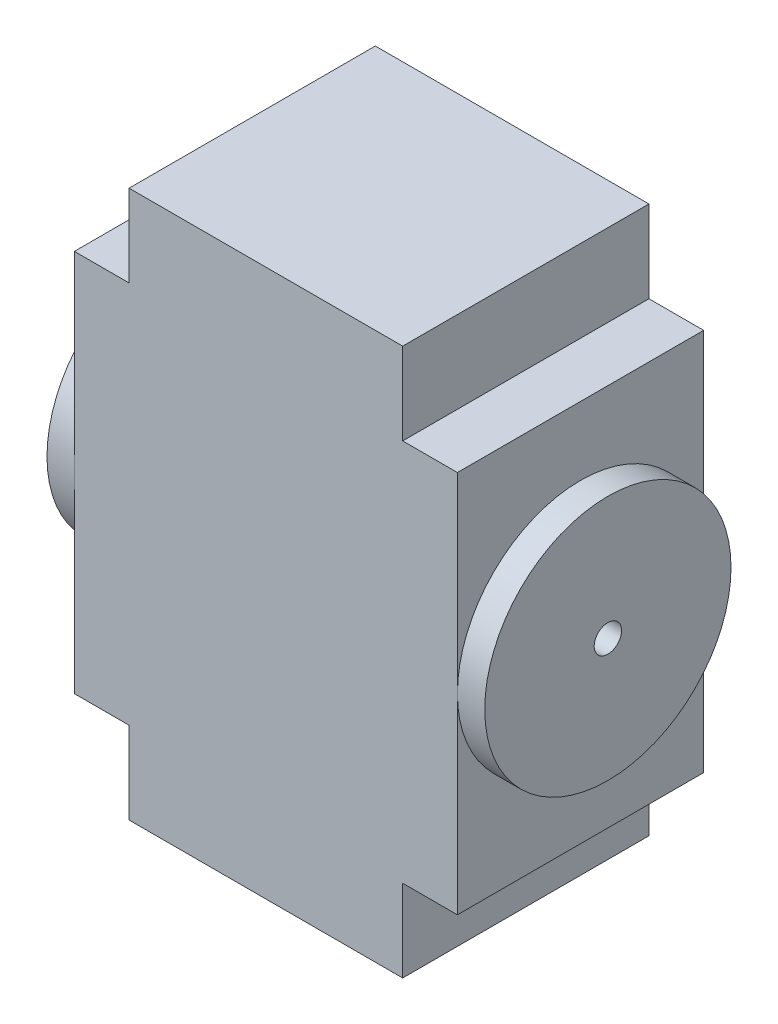
ISO-10303-21;
HEADER;
FILE_DESCRIPTION(('STEP AP214'),'2;1');
FILE_NAME('part.step','',(''),(''),'','','');
FILE_SCHEMA(('AUTOMOTIVE_DESIGN { 1 0 10303 214 1 1 1 1 }'));
ENDSEC;
DATA;
#1=APPLICATION_CONTEXT('core data for automotive mechanical design processes');
#2=APPLICATION_PROTOCOL_DEFINITION('international standard','automotive_design',2000,#1);
#3=PRODUCT_CONTEXT('',#1,'mechanical');
#4=PRODUCT('Part','Part','',(#3));
#5=PRODUCT_RELATED_PRODUCT_CATEGORY('part','',(#4));
#6=PRODUCT_DEFINITION_FORMATION('','',#4);
#7=PRODUCT_DEFINITION_CONTEXT('part definition',#1,'design');
#8=PRODUCT_DEFINITION('design','',#6,#7);
#9=PRODUCT_DEFINITION_SHAPE('','',#8);
#10=(LENGTH_UNIT() NAMED_UNIT(*) SI_UNIT(.MILLI.,.METRE.));
#11=(NAMED_UNIT(*) PLANE_ANGLE_UNIT() SI_UNIT($,.RADIAN.));
#12=(NAMED_UNIT(*) SI_UNIT($,.STERADIAN.) SOLID_ANGLE_UNIT());
#13=UNCERTAINTY_MEASURE_WITH_UNIT(LENGTH_MEASURE(1.E-05),#10,'distance_accuracy_value','');
#14=(GEOMETRIC_REPRESENTATION_CONTEXT(3) GLOBAL_UNCERTAINTY_ASSIGNED_CONTEXT((#13)) GLOBAL_UNIT_ASSIGNED_CONTEXT((#10,
#11,#12)) REPRESENTATION_CONTEXT('',''));
#15=CARTESIAN_POINT('',(0.,0.,0.));
#16=DIRECTION('',(0.,0.,1.));
#17=DIRECTION('',(1.,0.,0.));
#18=AXIS2_PLACEMENT_3D('',#15,#16,#17);
#19=CARTESIAN_POINT('',(-3.5,0.,0.));
#20=DIRECTION('',(-1.,0.,0.));
#21=DIRECTION('',(0.,0.,1.));
#22=AXIS2_PLACEMENT_3D('',#19,#20,#21);
#23=PLANE('',#22);
#24=DIRECTION('',(0.,-1.,0.));
#25=VECTOR('',#24,1.);
#26=CARTESIAN_POINT('',(-3.5,-3.5,0.));
#27=LINE('',#26,#25);
#28=CARTESIAN_POINT('',(-3.5,3.5,0.));
#29=VERTEX_POINT('',#28);
#30=CARTESIAN_POINT('',(-3.5,0.,0.));
#31=VERTEX_POINT('',#30);
#32=EDGE_CURVE('E152',#29,#31,#27,.T.);
#33=ORIENTED_EDGE('',*,*,#32,.T.);
#34=CARTESIAN_POINT('',(-3.5,0.,2.25));
#35=DIRECTION('',(1.,0.,0.));
#36=DIRECTION('',(0.,0.,-1.));
#37=AXIS2_PLACEMENT_3D('',#34,#35,#36);
#38=CIRCLE('',#37,2.25);
#39=CARTESIAN_POINT('',(-3.5,0.,4.5));
#40=VERTEX_POINT('',#39);
#41=EDGE_CURVE('E55',#31,#40,#38,.T.);
#42=ORIENTED_EDGE('',*,*,#41,.T.);
#43=DIRECTION('',(0.,1.,0.));
#44=VECTOR('',#43,1.);
#45=CARTESIAN_POINT('',(-3.5,-3.5,4.5));
#46=LINE('',#45,#44);
#47=CARTESIAN_POINT('',(-3.5,3.5,4.5));
#48=VERTEX_POINT('',#47);
#49=EDGE_CURVE('E149',#40,#48,#46,.T.);
#50=ORIENTED_EDGE('',*,*,#49,.T.);
#51=DIRECTION('',(0.,0.,-1.));
#52=VECTOR('',#51,1.);
#53=CARTESIAN_POINT('',(-3.5,3.5,4.5));
#54=LINE('',#53,#52);
#55=EDGE_CURVE('E173',#48,#29,#54,.T.);
#56=ORIENTED_EDGE('',*,*,#55,.T.);
#57=EDGE_LOOP('',(#33,#42,#50,#56));
#58=FACE_BOUND('',#57,.T.);
#59=ADVANCED_FACE('F43',(#58),#23,.T.);
#60=CARTESIAN_POINT('',(3.5,0.,0.));
#61=DIRECTION('',(-1.,0.,0.));
#62=DIRECTION('',(0.,0.,1.));
#63=AXIS2_PLACEMENT_3D('',#60,#61,#62);
#64=PLANE('',#63);
#65=CARTESIAN_POINT('',(3.5,0.,2.25));
#66=DIRECTION('',(1.,0.,0.));
#67=DIRECTION('',(0.,0.,-1.));
#68=AXIS2_PLACEMENT_3D('',#65,#66,#67);
#69=CIRCLE('',#68,2.25);
#70=CARTESIAN_POINT('',(3.5,0.,0.));
#71=VERTEX_POINT('',#70);
#72=CARTESIAN_POINT('',(3.5,0.,4.5));
#73=VERTEX_POINT('',#72);
#74=EDGE_CURVE('E290',#71,#73,#69,.T.);
#75=ORIENTED_EDGE('',*,*,#74,.F.);
#76=DIRECTION('',(0.,1.,0.));
#77=VECTOR('',#76,1.);
#78=CARTESIAN_POINT('',(3.5,-3.5,0.));
#79=LINE('',#78,#77);
#80=CARTESIAN_POINT('',(3.5,3.5,0.));
#81=VERTEX_POINT('',#80);
#82=EDGE_CURVE('E207',#71,#81,#79,.T.);
#83=ORIENTED_EDGE('',*,*,#82,.T.);
#84=DIRECTION('',(0.,0.,1.));
#85=VECTOR('',#84,1.);
#86=CARTESIAN_POINT('',(3.5,3.5,4.5));
#87=LINE('',#86,#85);
#88=CARTESIAN_POINT('',(3.5,3.5,4.5));
#89=VERTEX_POINT('',#88);
#90=EDGE_CURVE('E206',#81,#89,#87,.T.);
#91=ORIENTED_EDGE('',*,*,#90,.T.);
#92=DIRECTION('',(0.,-1.,0.));
#93=VECTOR('',#92,1.);
#94=CARTESIAN_POINT('',(3.5,-3.5,4.5));
#95=LINE('',#94,#93);
#96=EDGE_CURVE('E211',#89,#73,#95,.T.);
#97=ORIENTED_EDGE('',*,*,#96,.T.);
#98=EDGE_LOOP('',(#75,#83,#91,#97));
#99=FACE_BOUND('',#98,.T.);
#100=ADVANCED_FACE('F345',(#99),#64,.F.);
#101=CARTESIAN_POINT('',(-2.5,-5.,4.5));
#102=DIRECTION('',(1.,0.,0.));
#103=DIRECTION('',(0.,0.,-1.));
#104=AXIS2_PLACEMENT_3D('',#101,#102,#103);
#105=PLANE('',#104);
#106=DIRECTION('',(0.,0.,-1.));
#107=VECTOR('',#106,1.);
#108=CARTESIAN_POINT('',(-2.5,3.5,4.5));
#109=LINE('',#108,#107);
#110=CARTESIAN_POINT('',(-2.5,3.5,4.5));
#111=VERTEX_POINT('',#110);
#112=CARTESIAN_POINT('',(-2.5,3.5,0.));
#113=VERTEX_POINT('',#112);
#114=EDGE_CURVE('E184',#111,#113,#109,.T.);
#115=ORIENTED_EDGE('',*,*,#114,.F.);
#116=DIRECTION('',(0.,-1.,0.));
#117=VECTOR('',#116,1.);
#118=CARTESIAN_POINT('',(-2.5,-5.,4.5));
#119=LINE('',#118,#117);
#120=CARTESIAN_POINT('',(-2.5,5.,4.5));
#121=VERTEX_POINT('',#120);
#122=EDGE_CURVE('E250',#121,#111,#119,.T.);
#123=ORIENTED_EDGE('',*,*,#122,.F.);
#124=DIRECTION('',(0.,0.,-1.));
#125=VECTOR('',#124,1.);
#126=CARTESIAN_POINT('',(-2.5,5.,4.5));
#127=LINE('',#126,#125);
#128=CARTESIAN_POINT('',(-2.5,5.,0.));
#129=VERTEX_POINT('',#128);
#130=EDGE_CURVE('E276',#121,#129,#127,.T.);
#131=ORIENTED_EDGE('',*,*,#130,.T.);
#132=DIRECTION('',(0.,-1.,0.));
#133=VECTOR('',#132,1.);
#134=CARTESIAN_POINT('',(-2.5,-5.,0.));
#135=LINE('',#134,#133);
#136=EDGE_CURVE('E264',#129,#113,#135,.T.);
#137=ORIENTED_EDGE('',*,*,#136,.T.);
#138=EDGE_LOOP('',(#115,#123,#131,#137));
#139=FACE_BOUND('',#138,.T.);
#140=ADVANCED_FACE('F350',(#139),#105,.F.);
#141=DIRECTION('',(0.,0.,1.));
#142=VECTOR('',#141,1.);
#143=CARTESIAN_POINT('',(-2.5,-3.5,4.5));
#144=LINE('',#143,#142);
#145=CARTESIAN_POINT('',(-2.5,-3.5,0.));
#146=VERTEX_POINT('',#145);
#147=CARTESIAN_POINT('',(-2.5,-3.5,4.5));
#148=VERTEX_POINT('',#147);
#149=EDGE_CURVE('E180',#146,#148,#144,.T.);
#150=ORIENTED_EDGE('',*,*,#149,.F.);
#151=CARTESIAN_POINT('',(-2.5,-5.,0.));
#152=VERTEX_POINT('',#151);
#153=EDGE_CURVE('E263',#146,#152,#135,.T.);
#154=ORIENTED_EDGE('',*,*,#153,.T.);
#155=DIRECTION('',(0.,0.,-1.));
#156=VECTOR('',#155,1.);
#157=CARTESIAN_POINT('',(-2.5,-5.,4.5));
#158=LINE('',#157,#156);
#159=CARTESIAN_POINT('',(-2.5,-5.,4.5));
#160=VERTEX_POINT('',#159);
#161=EDGE_CURVE('E273',#160,#152,#158,.T.);
#162=ORIENTED_EDGE('',*,*,#161,.F.);
#163=EDGE_CURVE('E249',#148,#160,#119,.T.);
#164=ORIENTED_EDGE('',*,*,#163,.F.);
#165=EDGE_LOOP('',(#150,#154,#162,#164));
#166=FACE_BOUND('',#165,.T.);
#167=ADVANCED_FACE('F393',(#166),#105,.F.);
#168=CARTESIAN_POINT('',(2.5,-5.,4.5));
#169=DIRECTION('',(-1.,0.,0.));
#170=DIRECTION('',(0.,0.,1.));
#171=AXIS2_PLACEMENT_3D('',#168,#169,#170);
#172=PLANE('',#171);
#173=DIRECTION('',(0.,0.,-1.));
#174=VECTOR('',#173,1.);
#175=CARTESIAN_POINT('',(2.5,-3.5,4.5));
#176=LINE('',#175,#174);
#177=CARTESIAN_POINT('',(2.5,-3.5,4.5));
#178=VERTEX_POINT('',#177);
#179=CARTESIAN_POINT('',(2.5,-3.5,0.));
#180=VERTEX_POINT('',#179);
#181=EDGE_CURVE('E222',#178,#180,#176,.T.);
#182=ORIENTED_EDGE('',*,*,#181,.F.);
#183=DIRECTION('',(0.,1.,0.));
#184=VECTOR('',#183,1.);
#185=CARTESIAN_POINT('',(2.5,-5.,4.5));
#186=LINE('',#185,#184);
#187=CARTESIAN_POINT('',(2.5,-5.,4.5));
#188=VERTEX_POINT('',#187);
#189=EDGE_CURVE('E242',#188,#178,#186,.T.);
#190=ORIENTED_EDGE('',*,*,#189,.F.);
#191=DIRECTION('',(0.,0.,-1.));
#192=VECTOR('',#191,1.);
#193=CARTESIAN_POINT('',(2.5,-5.,4.5));
#194=LINE('',#193,#192);
#195=CARTESIAN_POINT('',(2.5,-5.,0.));
#196=VERTEX_POINT('',#195);
#197=EDGE_CURVE('E256',#188,#196,#194,.T.);
#198=ORIENTED_EDGE('',*,*,#197,.T.);
#199=DIRECTION('',(0.,1.,0.));
#200=VECTOR('',#199,1.);
#201=CARTESIAN_POINT('',(2.5,-5.,0.));
#202=LINE('',#201,#200);
#203=EDGE_CURVE('E257',#196,#180,#202,.T.);
#204=ORIENTED_EDGE('',*,*,#203,.T.);
#205=EDGE_LOOP('',(#182,#190,#198,#204));
#206=FACE_BOUND('',#205,.T.);
#207=ADVANCED_FACE('F45',(#206),#172,.F.);
#208=DIRECTION('',(0.,0.,1.));
#209=VECTOR('',#208,1.);
#210=CARTESIAN_POINT('',(2.5,3.5,4.5));
#211=LINE('',#210,#209);
#212=CARTESIAN_POINT('',(2.5,3.5,0.));
#213=VERTEX_POINT('',#212);
#214=CARTESIAN_POINT('',(2.5,3.5,4.5));
#215=VERTEX_POINT('',#214);
#216=EDGE_CURVE('E202',#213,#215,#211,.T.);
#217=ORIENTED_EDGE('',*,*,#216,.F.);
#218=CARTESIAN_POINT('',(2.5,5.,0.));
#219=VERTEX_POINT('',#218);
#220=EDGE_CURVE('E241',#213,#219,#202,.T.);
#221=ORIENTED_EDGE('',*,*,#220,.T.);
#222=DIRECTION('',(0.,0.,-1.));
#223=VECTOR('',#222,1.);
#224=CARTESIAN_POINT('',(2.5,5.,4.5));
#225=LINE('',#224,#223);
#226=CARTESIAN_POINT('',(2.5,5.,4.5));
#227=VERTEX_POINT('',#226);
#228=EDGE_CURVE('E47',#227,#219,#225,.T.);
#229=ORIENTED_EDGE('',*,*,#228,.F.);
#230=EDGE_CURVE('E246',#215,#227,#186,.T.);
#231=ORIENTED_EDGE('',*,*,#230,.F.);
#232=EDGE_LOOP('',(#217,#221,#229,#231));
#233=FACE_BOUND('',#232,.T.);
#234=ADVANCED_FACE('F395',(#233),#172,.F.);
#235=CARTESIAN_POINT('',(-2.5,5.,4.5));
#236=DIRECTION('',(0.,-1.,0.));
#237=DIRECTION('',(0.,0.,-1.));
#238=AXIS2_PLACEMENT_3D('',#235,#236,#237);
#239=PLANE('',#238);
#240=DIRECTION('',(-1.,0.,0.));
#241=VECTOR('',#240,1.);
#242=CARTESIAN_POINT('',(-2.5,5.,0.));
#243=LINE('',#242,#241);
#244=EDGE_CURVE('E260',#219,#129,#243,.T.);
#245=ORIENTED_EDGE('',*,*,#244,.T.);
#246=ORIENTED_EDGE('',*,*,#130,.F.);
#247=DIRECTION('',(-1.,0.,0.));
#248=VECTOR('',#247,1.);
#249=CARTESIAN_POINT('',(-2.5,5.,4.5));
#250=LINE('',#249,#248);
#251=EDGE_CURVE('E245',#227,#121,#250,.T.);
#252=ORIENTED_EDGE('',*,*,#251,.F.);
#253=ORIENTED_EDGE('',*,*,#228,.T.);
#254=EDGE_LOOP('',(#245,#246,#252,#253));
#255=FACE_BOUND('',#254,.T.);
#256=ADVANCED_FACE('F390',(#255),#239,.F.);
#257=CARTESIAN_POINT('',(-2.5,-5.,4.5));
#258=DIRECTION('',(0.,1.,0.));
#259=DIRECTION('',(0.,0.,1.));
#260=AXIS2_PLACEMENT_3D('',#257,#258,#259);
#261=PLANE('',#260);
#262=DIRECTION('',(1.,0.,0.));
#263=VECTOR('',#262,1.);
#264=CARTESIAN_POINT('',(-2.5,-5.,0.));
#265=LINE('',#264,#263);
#266=EDGE_CURVE('E267',#152,#196,#265,.T.);
#267=ORIENTED_EDGE('',*,*,#266,.T.);
#268=ORIENTED_EDGE('',*,*,#197,.F.);
#269=DIRECTION('',(1.,0.,0.));
#270=VECTOR('',#269,1.);
#271=CARTESIAN_POINT('',(-2.5,-5.,4.5));
#272=LINE('',#271,#270);
#273=EDGE_CURVE('E253',#160,#188,#272,.T.);
#274=ORIENTED_EDGE('',*,*,#273,.F.);
#275=ORIENTED_EDGE('',*,*,#161,.T.);
#276=EDGE_LOOP('',(#267,#268,#274,#275));
#277=FACE_BOUND('',#276,.T.);
#278=ADVANCED_FACE('F384',(#277),#261,.F.);
#279=CARTESIAN_POINT('',(0.,0.,4.5));
#280=DIRECTION('',(0.,0.,-1.));
#281=DIRECTION('',(-1.,0.,0.));
#282=AXIS2_PLACEMENT_3D('',#279,#280,#281);
#283=PLANE('',#282);
#284=ORIENTED_EDGE('',*,*,#189,.T.);
#285=DIRECTION('',(-1.,0.,0.));
#286=VECTOR('',#285,1.);
#287=CARTESIAN_POINT('',(3.5,-3.5,4.5));
#288=LINE('',#287,#286);
#289=CARTESIAN_POINT('',(3.5,-3.5,4.5));
#290=VERTEX_POINT('',#289);
#291=EDGE_CURVE('E229',#290,#178,#288,.T.);
#292=ORIENTED_EDGE('',*,*,#291,.F.);
#293=EDGE_CURVE('E210',#73,#290,#95,.T.);
#294=ORIENTED_EDGE('',*,*,#293,.F.);
#295=ORIENTED_EDGE('',*,*,#96,.F.);
#296=DIRECTION('',(-1.,0.,0.));
#297=VECTOR('',#296,1.);
#298=CARTESIAN_POINT('',(3.5,3.5,4.5));
#299=LINE('',#298,#297);
#300=EDGE_CURVE('E233',#89,#215,#299,.T.);
#301=ORIENTED_EDGE('',*,*,#300,.T.);
#302=ORIENTED_EDGE('',*,*,#230,.T.);
#303=ORIENTED_EDGE('',*,*,#251,.T.);
#304=ORIENTED_EDGE('',*,*,#122,.T.);
#305=DIRECTION('',(1.,0.,0.));
#306=VECTOR('',#305,1.);
#307=CARTESIAN_POINT('',(-3.5,3.5,4.5));
#308=LINE('',#307,#306);
#309=EDGE_CURVE('E164',#48,#111,#308,.T.);
#310=ORIENTED_EDGE('',*,*,#309,.F.);
#311=ORIENTED_EDGE('',*,*,#49,.F.);
#312=CARTESIAN_POINT('',(-3.5,-3.5,4.5));
#313=VERTEX_POINT('',#312);
#314=EDGE_CURVE('E161',#313,#40,#46,.T.);
#315=ORIENTED_EDGE('',*,*,#314,.F.);
#316=DIRECTION('',(1.,0.,0.));
#317=VECTOR('',#316,1.);
#318=CARTESIAN_POINT('',(-3.5,-3.5,4.5));
#319=LINE('',#318,#317);
#320=EDGE_CURVE('E195',#313,#148,#319,.T.);
#321=ORIENTED_EDGE('',*,*,#320,.T.);
#322=ORIENTED_EDGE('',*,*,#163,.T.);
#323=ORIENTED_EDGE('',*,*,#273,.T.);
#324=EDGE_LOOP('',(#284,#292,#294,#295,#301,#302,#303,#304,#310,#311,#315,#321,#322,#323));
#325=FACE_BOUND('',#324,.T.);
#326=ADVANCED_FACE('F159',(#325),#283,.F.);
#327=CARTESIAN_POINT('',(0.,0.,0.));
#328=DIRECTION('',(0.,0.,-1.));
#329=DIRECTION('',(-1.,0.,0.));
#330=AXIS2_PLACEMENT_3D('',#327,#328,#329);
#331=PLANE('',#330);
#332=ORIENTED_EDGE('',*,*,#203,.F.);
#333=ORIENTED_EDGE('',*,*,#266,.F.);
#334=ORIENTED_EDGE('',*,*,#153,.F.);
#335=DIRECTION('',(1.,0.,0.));
#336=VECTOR('',#335,1.);
#337=CARTESIAN_POINT('',(-3.5,-3.5,0.));
#338=LINE('',#337,#336);
#339=CARTESIAN_POINT('',(-3.5,-3.5,0.));
#340=VERTEX_POINT('',#339);
#341=EDGE_CURVE('E198',#340,#146,#338,.T.);
#342=ORIENTED_EDGE('',*,*,#341,.F.);
#343=EDGE_CURVE('E189',#31,#340,#27,.T.);
#344=ORIENTED_EDGE('',*,*,#343,.F.);
#345=ORIENTED_EDGE('',*,*,#32,.F.);
#346=DIRECTION('',(1.,0.,0.));
#347=VECTOR('',#346,1.);
#348=CARTESIAN_POINT('',(-3.5,3.5,0.));
#349=LINE('',#348,#347);
#350=EDGE_CURVE('E175',#29,#113,#349,.T.);
#351=ORIENTED_EDGE('',*,*,#350,.T.);
#352=ORIENTED_EDGE('',*,*,#136,.F.);
#353=ORIENTED_EDGE('',*,*,#244,.F.);
#354=ORIENTED_EDGE('',*,*,#220,.F.);
#355=DIRECTION('',(-1.,0.,0.));
#356=VECTOR('',#355,1.);
#357=CARTESIAN_POINT('',(3.5,3.5,0.));
#358=LINE('',#357,#356);
#359=EDGE_CURVE('E237',#81,#213,#358,.T.);
#360=ORIENTED_EDGE('',*,*,#359,.F.);
#361=ORIENTED_EDGE('',*,*,#82,.F.);
#362=CARTESIAN_POINT('',(3.5,-3.5,0.));
#363=VERTEX_POINT('',#362);
#364=EDGE_CURVE('E203',#363,#71,#79,.T.);
#365=ORIENTED_EDGE('',*,*,#364,.F.);
#366=DIRECTION('',(-1.,0.,0.));
#367=VECTOR('',#366,1.);
#368=CARTESIAN_POINT('',(3.5,-3.5,0.));
#369=LINE('',#368,#367);
#370=EDGE_CURVE('E218',#363,#180,#369,.T.);
#371=ORIENTED_EDGE('',*,*,#370,.T.);
#372=EDGE_LOOP('',(#332,#333,#334,#342,#344,#345,#351,#352,#353,#354,#360,#361,#365,#371));
#373=FACE_BOUND('',#372,.T.);
#374=ADVANCED_FACE('F380',(#373),#331,.T.);
#375=CARTESIAN_POINT('',(3.5,3.5,4.5));
#376=DIRECTION('',(0.,-1.,0.));
#377=DIRECTION('',(0.,0.,-1.));
#378=AXIS2_PLACEMENT_3D('',#375,#376,#377);
#379=PLANE('',#378);
#380=ORIENTED_EDGE('',*,*,#216,.T.);
#381=ORIENTED_EDGE('',*,*,#300,.F.);
#382=ORIENTED_EDGE('',*,*,#90,.F.);
#383=ORIENTED_EDGE('',*,*,#359,.T.);
#384=EDGE_LOOP('',(#380,#381,#382,#383));
#385=FACE_BOUND('',#384,.T.);
#386=ADVANCED_FACE('F376',(#385),#379,.F.);
#387=CARTESIAN_POINT('',(3.5,-3.5,4.5));
#388=DIRECTION('',(0.,1.,0.));
#389=DIRECTION('',(0.,0.,1.));
#390=AXIS2_PLACEMENT_3D('',#387,#388,#389);
#391=PLANE('',#390);
#392=ORIENTED_EDGE('',*,*,#181,.T.);
#393=ORIENTED_EDGE('',*,*,#370,.F.);
#394=DIRECTION('',(0.,0.,-1.));
#395=VECTOR('',#394,1.);
#396=CARTESIAN_POINT('',(3.5,-3.5,4.5));
#397=LINE('',#396,#395);
#398=EDGE_CURVE('E215',#290,#363,#397,.T.);
#399=ORIENTED_EDGE('',*,*,#398,.F.);
#400=ORIENTED_EDGE('',*,*,#291,.T.);
#401=EDGE_LOOP('',(#392,#393,#399,#400));
#402=FACE_BOUND('',#401,.T.);
#403=ADVANCED_FACE('F373',(#402),#391,.F.);
#404=EDGE_CURVE('E53',#73,#71,#69,.T.);
#405=ORIENTED_EDGE('',*,*,#404,.F.);
#406=ORIENTED_EDGE('',*,*,#293,.T.);
#407=ORIENTED_EDGE('',*,*,#398,.T.);
#408=ORIENTED_EDGE('',*,*,#364,.T.);
#409=EDGE_LOOP('',(#405,#406,#407,#408));
#410=FACE_BOUND('',#409,.T.);
#411=ADVANCED_FACE('F353',(#410),#64,.F.);
#412=CARTESIAN_POINT('',(-3.5,-3.5,4.5));
#413=DIRECTION('',(0.,1.,0.));
#414=DIRECTION('',(0.,0.,1.));
#415=AXIS2_PLACEMENT_3D('',#412,#413,#414);
#416=PLANE('',#415);
#417=ORIENTED_EDGE('',*,*,#149,.T.);
#418=ORIENTED_EDGE('',*,*,#320,.F.);
#419=DIRECTION('',(0.,0.,1.));
#420=VECTOR('',#419,1.);
#421=CARTESIAN_POINT('',(-3.5,-3.5,4.5));
#422=LINE('',#421,#420);
#423=EDGE_CURVE('E167',#340,#313,#422,.T.);
#424=ORIENTED_EDGE('',*,*,#423,.F.);
#425=ORIENTED_EDGE('',*,*,#341,.T.);
#426=EDGE_LOOP('',(#417,#418,#424,#425));
#427=FACE_BOUND('',#426,.T.);
#428=ADVANCED_FACE('F364',(#427),#416,.F.);
#429=CARTESIAN_POINT('',(-3.5,3.5,4.5));
#430=DIRECTION('',(0.,-1.,0.));
#431=DIRECTION('',(0.,0.,-1.));
#432=AXIS2_PLACEMENT_3D('',#429,#430,#431);
#433=PLANE('',#432);
#434=ORIENTED_EDGE('',*,*,#114,.T.);
#435=ORIENTED_EDGE('',*,*,#350,.F.);
#436=ORIENTED_EDGE('',*,*,#55,.F.);
#437=ORIENTED_EDGE('',*,*,#309,.T.);
#438=EDGE_LOOP('',(#434,#435,#436,#437));
#439=FACE_BOUND('',#438,.T.);
#440=ADVANCED_FACE('F358',(#439),#433,.F.);
#441=ORIENTED_EDGE('',*,*,#314,.T.);
#442=EDGE_CURVE('E11',#40,#31,#38,.T.);
#443=ORIENTED_EDGE('',*,*,#442,.T.);
#444=ORIENTED_EDGE('',*,*,#343,.T.);
#445=ORIENTED_EDGE('',*,*,#423,.T.);
#446=EDGE_LOOP('',(#441,#443,#444,#445));
#447=FACE_BOUND('',#446,.T.);
#448=ADVANCED_FACE('F169',(#447),#23,.T.);
#449=CARTESIAN_POINT('',(4.,0.,2.25));
#450=DIRECTION('',(-1.,0.,0.));
#451=DIRECTION('',(0.,0.,1.));
#452=AXIS2_PLACEMENT_3D('',#449,#450,#451);
#453=CYLINDRICAL_SURFACE('',#452,2.25);
#454=CARTESIAN_POINT('',(4.,0.,2.25));
#455=DIRECTION('',(1.,0.,0.));
#456=DIRECTION('',(0.,0.,-1.));
#457=AXIS2_PLACEMENT_3D('',#454,#455,#456);
#458=CIRCLE('',#457,2.25);
#459=CARTESIAN_POINT('',(4.,0.,0.));
#460=VERTEX_POINT('',#459);
#461=EDGE_CURVE('E185',#460,#460,#458,.T.);
#462=ORIENTED_EDGE('',*,*,#461,.F.);
#463=EDGE_LOOP('',(#462));
#464=FACE_BOUND('',#463,.T.);
#465=ORIENTED_EDGE('',*,*,#74,.T.);
#466=ORIENTED_EDGE('',*,*,#404,.T.);
#467=EDGE_LOOP('',(#465,#466));
#468=FACE_BOUND('',#467,.T.);
#469=ADVANCED_FACE('F357',(#464,#468),#453,.T.);
#470=CARTESIAN_POINT('',(4.,0.,2.25));
#471=DIRECTION('',(1.,0.,0.));
#472=DIRECTION('',(0.,0.,-1.));
#473=AXIS2_PLACEMENT_3D('',#470,#471,#472);
#474=PLANE('',#473);
#475=CARTESIAN_POINT('',(4.,0.,2.25));
#476=DIRECTION('',(1.,0.,0.));
#477=DIRECTION('',(0.,0.,-1.));
#478=AXIS2_PLACEMENT_3D('',#475,#476,#477);
#479=CIRCLE('',#478,0.25);
#480=CARTESIAN_POINT('',(4.,0.,2.));
#481=VERTEX_POINT('',#480);
#482=EDGE_CURVE('E304',#481,#481,#479,.T.);
#483=ORIENTED_EDGE('',*,*,#482,.F.);
#484=EDGE_LOOP('',(#483));
#485=FACE_BOUND('',#484,.T.);
#486=ORIENTED_EDGE('',*,*,#461,.T.);
#487=EDGE_LOOP('',(#486));
#488=FACE_BOUND('',#487,.T.);
#489=ADVANCED_FACE('F342',(#485,#488),#474,.T.);
#490=CARTESIAN_POINT('',(-4.,0.,2.25));
#491=DIRECTION('',(1.,0.,0.));
#492=DIRECTION('',(0.,0.,-1.));
#493=AXIS2_PLACEMENT_3D('',#490,#491,#492);
#494=CYLINDRICAL_SURFACE('',#493,2.25);
#495=CARTESIAN_POINT('',(-4.,0.,2.25));
#496=DIRECTION('',(1.,0.,0.));
#497=DIRECTION('',(0.,0.,-1.));
#498=AXIS2_PLACEMENT_3D('',#495,#496,#497);
#499=CIRCLE('',#498,2.25);
#500=CARTESIAN_POINT('',(-4.,0.,0.));
#501=VERTEX_POINT('',#500);
#502=EDGE_CURVE('E154',#501,#501,#499,.T.);
#503=ORIENTED_EDGE('',*,*,#502,.T.);
#504=EDGE_LOOP('',(#503));
#505=FACE_BOUND('',#504,.T.);
#506=ORIENTED_EDGE('',*,*,#41,.F.);
#507=ORIENTED_EDGE('',*,*,#442,.F.);
#508=EDGE_LOOP('',(#506,#507));
#509=FACE_BOUND('',#508,.T.);
#510=ADVANCED_FACE('F142',(#505,#509),#494,.T.);
#511=CARTESIAN_POINT('',(-4.,0.,2.25));
#512=DIRECTION('',(-1.,0.,0.));
#513=DIRECTION('',(0.,0.,-1.));
#514=AXIS2_PLACEMENT_3D('',#511,#512,#513);
#515=PLANE('',#514);
#516=CARTESIAN_POINT('',(-4.,0.,2.25));
#517=DIRECTION('',(-1.,0.,0.));
#518=DIRECTION('',(0.,0.,1.));
#519=AXIS2_PLACEMENT_3D('',#516,#517,#518);
#520=CIRCLE('',#519,0.25);
#521=CARTESIAN_POINT('',(-4.,0.,2.5));
#522=VERTEX_POINT('',#521);
#523=EDGE_CURVE('E312',#522,#522,#520,.T.);
#524=ORIENTED_EDGE('',*,*,#523,.F.);
#525=EDGE_LOOP('',(#524));
#526=FACE_BOUND('',#525,.T.);
#527=ORIENTED_EDGE('',*,*,#502,.F.);
#528=EDGE_LOOP('',(#527));
#529=FACE_BOUND('',#528,.T.);
#530=ADVANCED_FACE('F329',(#526,#529),#515,.T.);
#531=CARTESIAN_POINT('',(3.5,0.,2.25));
#532=DIRECTION('',(1.,0.,0.));
#533=DIRECTION('',(0.,0.,-1.));
#534=AXIS2_PLACEMENT_3D('',#531,#532,#533);
#535=CYLINDRICAL_SURFACE('',#534,0.25);
#536=CARTESIAN_POINT('',(3.5,0.,2.25));
#537=DIRECTION('',(1.,0.,0.));
#538=DIRECTION('',(0.,0.,-1.));
#539=AXIS2_PLACEMENT_3D('',#536,#537,#538);
#540=CIRCLE('',#539,0.25);
#541=CARTESIAN_POINT('',(3.5,0.,2.));
#542=VERTEX_POINT('',#541);
#543=EDGE_CURVE('E155',#542,#542,#540,.T.);
#544=ORIENTED_EDGE('',*,*,#543,.F.);
#545=EDGE_LOOP('',(#544));
#546=FACE_BOUND('',#545,.T.);
#547=ORIENTED_EDGE('',*,*,#482,.T.);
#548=EDGE_LOOP('',(#547));
#549=FACE_BOUND('',#548,.T.);
#550=ADVANCED_FACE('F332',(#546,#549),#535,.F.);
#551=CARTESIAN_POINT('',(3.5,0.,2.25));
#552=DIRECTION('',(1.,0.,0.));
#553=DIRECTION('',(0.,0.,-1.));
#554=AXIS2_PLACEMENT_3D('',#551,#552,#553);
#555=PLANE('',#554);
#556=ORIENTED_EDGE('',*,*,#543,.T.);
#557=EDGE_LOOP('',(#556));
#558=FACE_BOUND('',#557,.T.);
#559=ADVANCED_FACE('F325',(#558),#555,.T.);
#560=CARTESIAN_POINT('',(-3.5,0.,2.25));
#561=DIRECTION('',(-1.,0.,0.));
#562=DIRECTION('',(0.,0.,1.));
#563=AXIS2_PLACEMENT_3D('',#560,#561,#562);
#564=CYLINDRICAL_SURFACE('',#563,0.25);
#565=CARTESIAN_POINT('',(-3.5,0.,2.25));
#566=DIRECTION('',(-1.,0.,0.));
#567=DIRECTION('',(0.,0.,1.));
#568=AXIS2_PLACEMENT_3D('',#565,#566,#567);
#569=CIRCLE('',#568,0.25);
#570=CARTESIAN_POINT('',(-3.5,0.,2.5));
#571=VERTEX_POINT('',#570);
#572=EDGE_CURVE('E308',#571,#571,#569,.T.);
#573=ORIENTED_EDGE('',*,*,#572,.F.);
#574=EDGE_LOOP('',(#573));
#575=FACE_BOUND('',#574,.T.);
#576=ORIENTED_EDGE('',*,*,#523,.T.);
#577=EDGE_LOOP('',(#576));
#578=FACE_BOUND('',#577,.T.);
#579=ADVANCED_FACE('F322',(#575,#578),#564,.F.);
#580=CARTESIAN_POINT('',(-3.5,0.,2.25));
#581=DIRECTION('',(-1.,0.,0.));
#582=DIRECTION('',(0.,0.,1.));
#583=AXIS2_PLACEMENT_3D('',#580,#581,#582);
#584=PLANE('',#583);
#585=ORIENTED_EDGE('',*,*,#572,.T.);
#586=EDGE_LOOP('',(#585));
#587=FACE_BOUND('',#586,.T.);
#588=ADVANCED_FACE('F320',(#587),#584,.T.);
#589=CLOSED_SHELL('',(#59,#100,#140,#167,#207,#234,#256,#278,#326,#374,#386,#403,#411,#428,#440,
#448,#469,#489,#510,#530,#550,#559,#579,#588));
#590=MANIFOLD_SOLID_BREP('B2',#589);
#591=ADVANCED_BREP_SHAPE_REPRESENTATION('',(#18,#590),#14);
#592=SHAPE_DEFINITION_REPRESENTATION(#9,#591);
ENDSEC;
END-ISO-10303-21;
